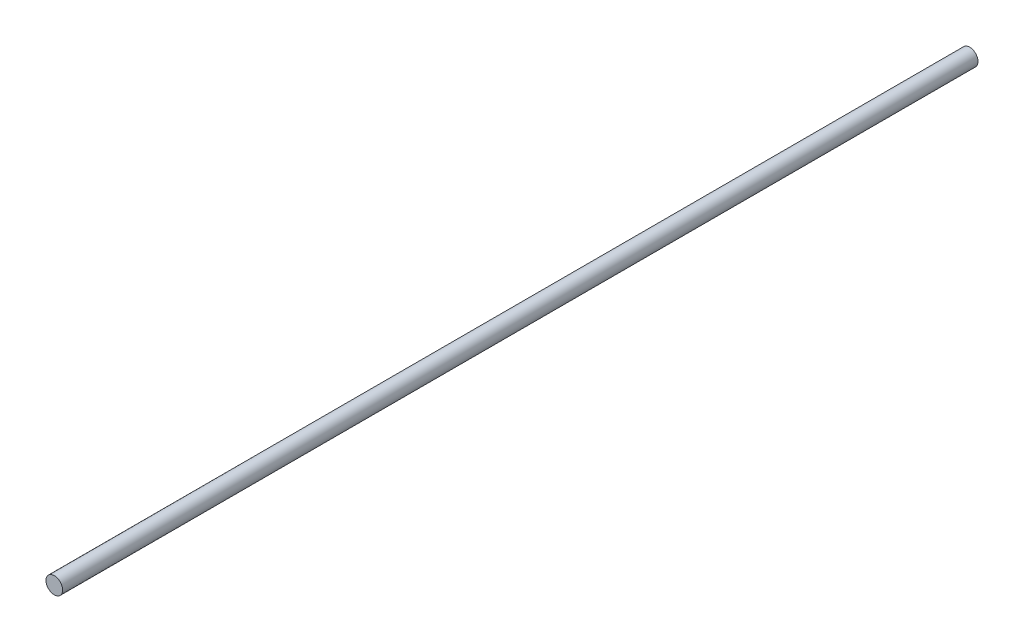
ISO-10303-21;
HEADER;
FILE_DESCRIPTION(('STEP AP214'),'2;1');
FILE_NAME('part.step','',(''),(''),'','','');
FILE_SCHEMA(('AUTOMOTIVE_DESIGN { 1 0 10303 214 1 1 1 1 }'));
ENDSEC;
DATA;
#1=APPLICATION_CONTEXT('core data for automotive mechanical design processes');
#2=APPLICATION_PROTOCOL_DEFINITION('international standard','automotive_design',2000,#1);
#3=PRODUCT_CONTEXT('',#1,'mechanical');
#4=PRODUCT('Part','Part','',(#3));
#5=PRODUCT_RELATED_PRODUCT_CATEGORY('part','',(#4));
#6=PRODUCT_DEFINITION_FORMATION('','',#4);
#7=PRODUCT_DEFINITION_CONTEXT('part definition',#1,'design');
#8=PRODUCT_DEFINITION('design','',#6,#7);
#9=PRODUCT_DEFINITION_SHAPE('','',#8);
#10=(LENGTH_UNIT() NAMED_UNIT(*) SI_UNIT(.MILLI.,.METRE.));
#11=(NAMED_UNIT(*) PLANE_ANGLE_UNIT() SI_UNIT($,.RADIAN.));
#12=(NAMED_UNIT(*) SI_UNIT($,.STERADIAN.) SOLID_ANGLE_UNIT());
#13=UNCERTAINTY_MEASURE_WITH_UNIT(LENGTH_MEASURE(1.E-05),#10,'distance_accuracy_value','');
#14=(GEOMETRIC_REPRESENTATION_CONTEXT(3) GLOBAL_UNCERTAINTY_ASSIGNED_CONTEXT((#13)) GLOBAL_UNIT_ASSIGNED_CONTEXT((#10,
#11,#12)) REPRESENTATION_CONTEXT('',''));
#15=CARTESIAN_POINT('',(0.,0.,0.));
#16=DIRECTION('',(0.,0.,1.));
#17=DIRECTION('',(1.,0.,0.));
#18=AXIS2_PLACEMENT_3D('',#15,#16,#17);
#19=CARTESIAN_POINT('',(0.,0.,440.));
#20=DIRECTION('',(0.,0.,-1.));
#21=DIRECTION('',(-1.,0.,0.));
#22=AXIS2_PLACEMENT_3D('',#19,#20,#21);
#23=CYLINDRICAL_SURFACE('',#22,4.);
#24=CARTESIAN_POINT('',(0.,0.,440.));
#25=DIRECTION('',(0.,0.,1.));
#26=DIRECTION('',(1.,0.,0.));
#27=AXIS2_PLACEMENT_3D('',#24,#25,#26);
#28=CIRCLE('',#27,4.);
#29=CARTESIAN_POINT('',(4.,0.,440.));
#30=VERTEX_POINT('',#29);
#31=EDGE_CURVE('E10',#30,#30,#28,.T.);
#32=ORIENTED_EDGE('',*,*,#31,.F.);
#33=EDGE_LOOP('',(#32));
#34=FACE_BOUND('',#33,.T.);
#35=CARTESIAN_POINT('',(0.,0.,0.));
#36=DIRECTION('',(0.,0.,1.));
#37=DIRECTION('',(1.,0.,0.));
#38=AXIS2_PLACEMENT_3D('',#35,#36,#37);
#39=CIRCLE('',#38,4.);
#40=CARTESIAN_POINT('',(4.,0.,0.));
#41=VERTEX_POINT('',#40);
#42=EDGE_CURVE('E40',#41,#41,#39,.T.);
#43=ORIENTED_EDGE('',*,*,#42,.T.);
#44=EDGE_LOOP('',(#43));
#45=FACE_BOUND('',#44,.T.);
#46=ADVANCED_FACE('F37',(#34,#45),#23,.T.);
#47=CARTESIAN_POINT('',(0.,0.,440.));
#48=DIRECTION('',(0.,0.,1.));
#49=DIRECTION('',(1.,0.,0.));
#50=AXIS2_PLACEMENT_3D('',#47,#48,#49);
#51=PLANE('',#50);
#52=ORIENTED_EDGE('',*,*,#31,.T.);
#53=EDGE_LOOP('',(#52));
#54=FACE_BOUND('',#53,.T.);
#55=ADVANCED_FACE('F54',(#54),#51,.T.);
#56=CARTESIAN_POINT('',(0.,0.,0.));
#57=DIRECTION('',(0.,0.,1.));
#58=DIRECTION('',(1.,0.,0.));
#59=AXIS2_PLACEMENT_3D('',#56,#57,#58);
#60=PLANE('',#59);
#61=ORIENTED_EDGE('',*,*,#42,.F.);
#62=EDGE_LOOP('',(#61));
#63=FACE_BOUND('',#62,.T.);
#64=ADVANCED_FACE('F52',(#63),#60,.F.);
#65=CLOSED_SHELL('',(#46,#55,#64));
#66=MANIFOLD_SOLID_BREP('B2',#65);
#67=ADVANCED_BREP_SHAPE_REPRESENTATION('',(#18,#66),#14);
#68=SHAPE_DEFINITION_REPRESENTATION(#9,#67);
ENDSEC;
END-ISO-10303-21;
